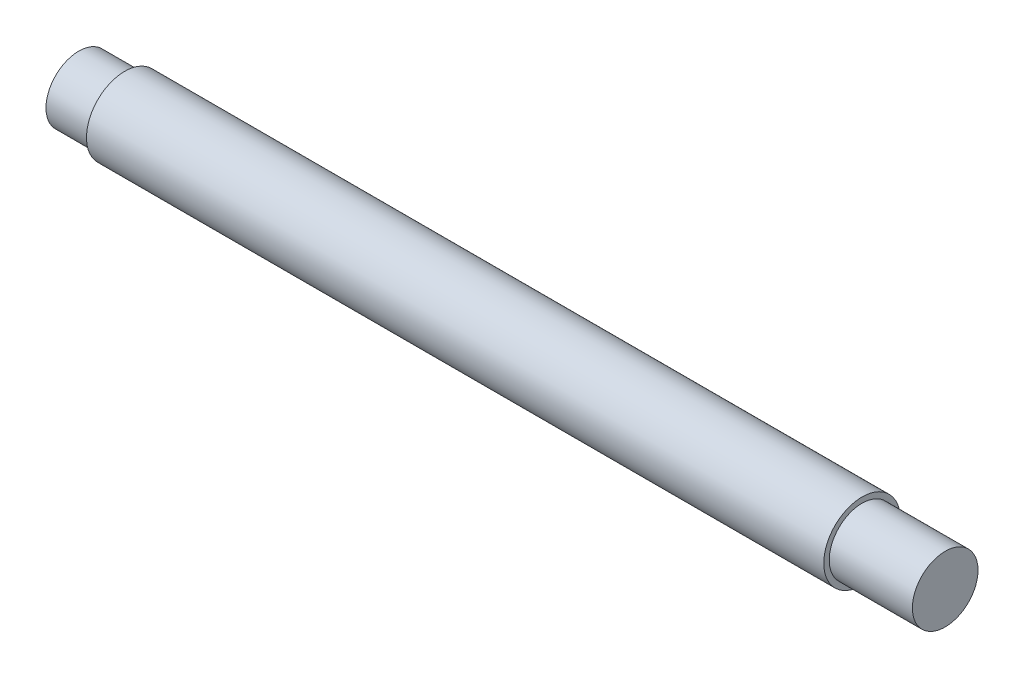
ISO-10303-21;
HEADER;
FILE_DESCRIPTION(('STEP AP214'),'2;1');
FILE_NAME('part.step','',(''),(''),'','','');
FILE_SCHEMA(('AUTOMOTIVE_DESIGN { 1 0 10303 214 1 1 1 1 }'));
ENDSEC;
DATA;
#1=APPLICATION_CONTEXT('core data for automotive mechanical design processes');
#2=APPLICATION_PROTOCOL_DEFINITION('international standard','automotive_design',2000,#1);
#3=PRODUCT_CONTEXT('',#1,'mechanical');
#4=PRODUCT('Part','Part','',(#3));
#5=PRODUCT_RELATED_PRODUCT_CATEGORY('part','',(#4));
#6=PRODUCT_DEFINITION_FORMATION('','',#4);
#7=PRODUCT_DEFINITION_CONTEXT('part definition',#1,'design');
#8=PRODUCT_DEFINITION('design','',#6,#7);
#9=PRODUCT_DEFINITION_SHAPE('','',#8);
#10=(LENGTH_UNIT() NAMED_UNIT(*) SI_UNIT(.MILLI.,.METRE.));
#11=(NAMED_UNIT(*) PLANE_ANGLE_UNIT() SI_UNIT($,.RADIAN.));
#12=(NAMED_UNIT(*) SI_UNIT($,.STERADIAN.) SOLID_ANGLE_UNIT());
#13=UNCERTAINTY_MEASURE_WITH_UNIT(LENGTH_MEASURE(1.E-05),#10,'distance_accuracy_value','');
#14=(GEOMETRIC_REPRESENTATION_CONTEXT(3) GLOBAL_UNCERTAINTY_ASSIGNED_CONTEXT((#13)) GLOBAL_UNIT_ASSIGNED_CONTEXT((#10,
#11,#12)) REPRESENTATION_CONTEXT('',''));
#15=CARTESIAN_POINT('',(0.,0.,0.));
#16=DIRECTION('',(0.,0.,1.));
#17=DIRECTION('',(1.,0.,0.));
#18=AXIS2_PLACEMENT_3D('',#15,#16,#17);
#19=CARTESIAN_POINT('',(-168.5,0.,0.));
#20=DIRECTION('',(1.,0.,0.));
#21=DIRECTION('',(0.,0.,-1.));
#22=AXIS2_PLACEMENT_3D('',#19,#20,#21);
#23=PLANE('',#22);
#24=CARTESIAN_POINT('',(-168.5,0.,0.));
#25=DIRECTION('',(1.,0.,0.));
#26=DIRECTION('',(0.,0.,-1.));
#27=AXIS2_PLACEMENT_3D('',#24,#25,#26);
#28=CIRCLE('',#27,17.5);
#29=CARTESIAN_POINT('',(-168.5,0.,-17.5));
#30=VERTEX_POINT('',#29);
#31=EDGE_CURVE('E32',#30,#30,#28,.T.);
#32=ORIENTED_EDGE('',*,*,#31,.F.);
#33=EDGE_LOOP('',(#32));
#34=FACE_BOUND('',#33,.T.);
#35=CARTESIAN_POINT('',(-168.5,0.,0.));
#36=DIRECTION('',(1.,0.,0.));
#37=DIRECTION('',(0.,0.,-1.));
#38=AXIS2_PLACEMENT_3D('',#35,#36,#37);
#39=CIRCLE('',#38,15.);
#40=CARTESIAN_POINT('',(-168.5,0.,-15.));
#41=VERTEX_POINT('',#40);
#42=EDGE_CURVE('E10',#41,#41,#39,.F.);
#43=ORIENTED_EDGE('',*,*,#42,.F.);
#44=EDGE_LOOP('',(#43));
#45=FACE_BOUND('',#44,.T.);
#46=ADVANCED_FACE('F15',(#34,#45),#23,.F.);
#47=CARTESIAN_POINT('',(168.5,0.,0.));
#48=DIRECTION('',(1.,0.,0.));
#49=DIRECTION('',(0.,0.,-1.));
#50=AXIS2_PLACEMENT_3D('',#47,#48,#49);
#51=PLANE('',#50);
#52=CARTESIAN_POINT('',(168.5,0.,0.));
#53=DIRECTION('',(1.,0.,0.));
#54=DIRECTION('',(0.,0.,-1.));
#55=AXIS2_PLACEMENT_3D('',#52,#53,#54);
#56=CIRCLE('',#55,17.5);
#57=CARTESIAN_POINT('',(168.5,0.,-17.5));
#58=VERTEX_POINT('',#57);
#59=EDGE_CURVE('E23',#58,#58,#56,.T.);
#60=ORIENTED_EDGE('',*,*,#59,.T.);
#61=EDGE_LOOP('',(#60));
#62=FACE_BOUND('',#61,.T.);
#63=CARTESIAN_POINT('',(168.5,0.,0.));
#64=DIRECTION('',(1.,0.,0.));
#65=DIRECTION('',(0.,0.,-1.));
#66=AXIS2_PLACEMENT_3D('',#63,#64,#65);
#67=CIRCLE('',#66,15.);
#68=CARTESIAN_POINT('',(168.5,0.,-15.));
#69=VERTEX_POINT('',#68);
#70=EDGE_CURVE('E42',#69,#69,#67,.T.);
#71=ORIENTED_EDGE('',*,*,#70,.F.);
#72=EDGE_LOOP('',(#71));
#73=FACE_BOUND('',#72,.T.);
#74=ADVANCED_FACE('F71',(#62,#73),#51,.T.);
#75=CARTESIAN_POINT('',(168.5,0.,0.));
#76=DIRECTION('',(-1.,0.,0.));
#77=DIRECTION('',(0.,0.,1.));
#78=AXIS2_PLACEMENT_3D('',#75,#76,#77);
#79=CYLINDRICAL_SURFACE('',#78,17.5);
#80=ORIENTED_EDGE('',*,*,#59,.F.);
#81=EDGE_LOOP('',(#80));
#82=FACE_BOUND('',#81,.T.);
#83=ORIENTED_EDGE('',*,*,#31,.T.);
#84=EDGE_LOOP('',(#83));
#85=FACE_BOUND('',#84,.T.);
#86=ADVANCED_FACE('F17',(#82,#85),#79,.T.);
#87=CARTESIAN_POINT('',(206.5,0.,0.));
#88=DIRECTION('',(-1.,0.,0.));
#89=DIRECTION('',(0.,0.,1.));
#90=AXIS2_PLACEMENT_3D('',#87,#88,#89);
#91=CYLINDRICAL_SURFACE('',#90,15.);
#92=CARTESIAN_POINT('',(206.5,0.,0.));
#93=DIRECTION('',(1.,0.,0.));
#94=DIRECTION('',(0.,0.,-1.));
#95=AXIS2_PLACEMENT_3D('',#92,#93,#94);
#96=CIRCLE('',#95,15.);
#97=CARTESIAN_POINT('',(206.5,0.,-15.));
#98=VERTEX_POINT('',#97);
#99=EDGE_CURVE('E40',#98,#98,#96,.T.);
#100=ORIENTED_EDGE('',*,*,#99,.F.);
#101=EDGE_LOOP('',(#100));
#102=FACE_BOUND('',#101,.T.);
#103=ORIENTED_EDGE('',*,*,#70,.T.);
#104=EDGE_LOOP('',(#103));
#105=FACE_BOUND('',#104,.T.);
#106=ADVANCED_FACE('F67',(#102,#105),#91,.T.);
#107=CARTESIAN_POINT('',(206.5,0.,0.));
#108=DIRECTION('',(1.,0.,0.));
#109=DIRECTION('',(0.,0.,-1.));
#110=AXIS2_PLACEMENT_3D('',#107,#108,#109);
#111=PLANE('',#110);
#112=ORIENTED_EDGE('',*,*,#99,.T.);
#113=EDGE_LOOP('',(#112));
#114=FACE_BOUND('',#113,.T.);
#115=ADVANCED_FACE('F58',(#114),#111,.T.);
#116=CARTESIAN_POINT('',(-189.5,0.,0.));
#117=DIRECTION('',(1.,0.,0.));
#118=DIRECTION('',(0.,0.,-1.));
#119=AXIS2_PLACEMENT_3D('',#116,#117,#118);
#120=CYLINDRICAL_SURFACE('',#119,15.);
#121=CARTESIAN_POINT('',(-189.5,0.,0.));
#122=DIRECTION('',(-1.,0.,0.));
#123=DIRECTION('',(0.,0.,1.));
#124=AXIS2_PLACEMENT_3D('',#121,#122,#123);
#125=CIRCLE('',#124,15.);
#126=CARTESIAN_POINT('',(-189.5,0.,15.));
#127=VERTEX_POINT('',#126);
#128=EDGE_CURVE('E46',#127,#127,#125,.T.);
#129=ORIENTED_EDGE('',*,*,#128,.F.);
#130=EDGE_LOOP('',(#129));
#131=FACE_BOUND('',#130,.T.);
#132=ORIENTED_EDGE('',*,*,#42,.T.);
#133=EDGE_LOOP('',(#132));
#134=FACE_BOUND('',#133,.T.);
#135=ADVANCED_FACE('F56',(#131,#134),#120,.T.);
#136=CARTESIAN_POINT('',(-189.5,0.,0.));
#137=DIRECTION('',(-1.,0.,0.));
#138=DIRECTION('',(0.,0.,1.));
#139=AXIS2_PLACEMENT_3D('',#136,#137,#138);
#140=PLANE('',#139);
#141=ORIENTED_EDGE('',*,*,#128,.T.);
#142=EDGE_LOOP('',(#141));
#143=FACE_BOUND('',#142,.T.);
#144=ADVANCED_FACE('F54',(#143),#140,.T.);
#145=CLOSED_SHELL('',(#46,#74,#86,#106,#115,#135,#144));
#146=MANIFOLD_SOLID_BREP('B1',#145);
#147=ADVANCED_BREP_SHAPE_REPRESENTATION('',(#18,#146),#14);
#148=SHAPE_DEFINITION_REPRESENTATION(#9,#147);
ENDSEC;
END-ISO-10303-21;
